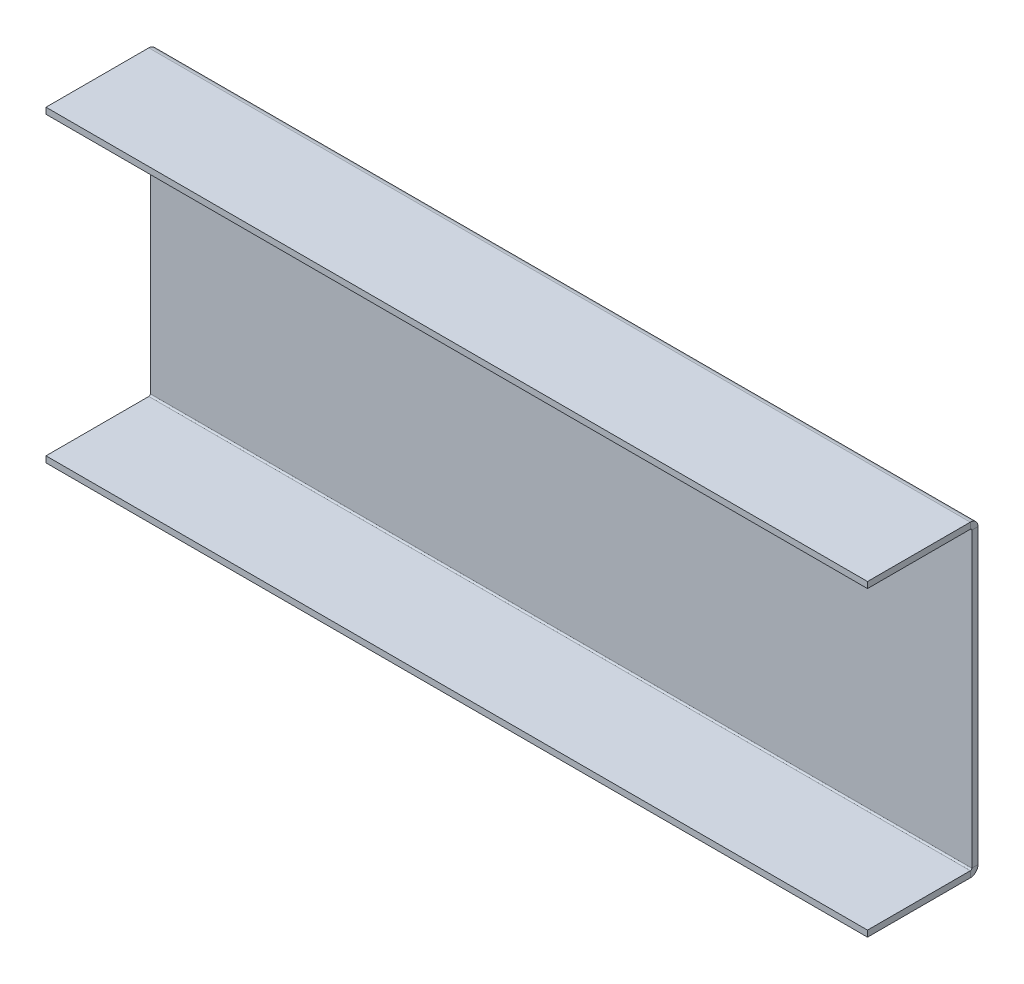
ISO-10303-21;
HEADER;
FILE_DESCRIPTION(('STEP AP214'),'2;1');
FILE_NAME('part.step','',(''),(''),'','','');
FILE_SCHEMA(('AUTOMOTIVE_DESIGN { 1 0 10303 214 1 1 1 1 }'));
ENDSEC;
DATA;
#1=APPLICATION_CONTEXT('core data for automotive mechanical design processes');
#2=APPLICATION_PROTOCOL_DEFINITION('international standard','automotive_design',2000,#1);
#3=PRODUCT_CONTEXT('',#1,'mechanical');
#4=PRODUCT('Part','Part','',(#3));
#5=PRODUCT_RELATED_PRODUCT_CATEGORY('part','',(#4));
#6=PRODUCT_DEFINITION_FORMATION('','',#4);
#7=PRODUCT_DEFINITION_CONTEXT('part definition',#1,'design');
#8=PRODUCT_DEFINITION('design','',#6,#7);
#9=PRODUCT_DEFINITION_SHAPE('','',#8);
#10=(LENGTH_UNIT() NAMED_UNIT(*) SI_UNIT(.MILLI.,.METRE.));
#11=(NAMED_UNIT(*) PLANE_ANGLE_UNIT() SI_UNIT($,.RADIAN.));
#12=(NAMED_UNIT(*) SI_UNIT($,.STERADIAN.) SOLID_ANGLE_UNIT());
#13=UNCERTAINTY_MEASURE_WITH_UNIT(LENGTH_MEASURE(1.E-05),#10,'distance_accuracy_value','');
#14=(GEOMETRIC_REPRESENTATION_CONTEXT(3) GLOBAL_UNCERTAINTY_ASSIGNED_CONTEXT((#13)) GLOBAL_UNIT_ASSIGNED_CONTEXT((#10,
#11,#12)) REPRESENTATION_CONTEXT('',''));
#15=CARTESIAN_POINT('',(0.,0.,0.));
#16=DIRECTION('',(0.,0.,1.));
#17=DIRECTION('',(1.,0.,0.));
#18=AXIS2_PLACEMENT_3D('',#15,#16,#17);
#19=CARTESIAN_POINT('',(0.,0.,-3.));
#20=DIRECTION('',(0.,0.,1.));
#21=DIRECTION('',(1.,0.,0.));
#22=AXIS2_PLACEMENT_3D('',#19,#20,#21);
#23=PLANE('',#22);
#24=DIRECTION('',(-1.,0.,0.));
#25=VECTOR('',#24,1.);
#26=CARTESIAN_POINT('',(-200.,71.2634,-3.00000000000002));
#27=LINE('',#26,#25);
#28=CARTESIAN_POINT('',(-200.,71.2634,-3.00000000000002));
#29=VERTEX_POINT('',#28);
#30=CARTESIAN_POINT('',(200.,71.2634,-3.));
#31=VERTEX_POINT('',#30);
#32=EDGE_CURVE('E209',#29,#31,#27,.F.);
#33=ORIENTED_EDGE('',*,*,#32,.T.);
#34=DIRECTION('',(0.,1.,0.));
#35=VECTOR('',#34,1.);
#36=CARTESIAN_POINT('',(200.,75.,-3.));
#37=LINE('',#36,#35);
#38=CARTESIAN_POINT('',(200.,-71.2634,-2.99999999999998));
#39=VERTEX_POINT('',#38);
#40=EDGE_CURVE('E86',#39,#31,#37,.T.);
#41=ORIENTED_EDGE('',*,*,#40,.F.);
#42=DIRECTION('',(1.,0.,0.));
#43=VECTOR('',#42,1.);
#44=CARTESIAN_POINT('',(200.,-71.2634,-2.99999999999998));
#45=LINE('',#44,#43);
#46=CARTESIAN_POINT('',(-200.,-71.2634,-3.));
#47=VERTEX_POINT('',#46);
#48=EDGE_CURVE('E262',#39,#47,#45,.F.);
#49=ORIENTED_EDGE('',*,*,#48,.T.);
#50=DIRECTION('',(0.,-1.,0.));
#51=VECTOR('',#50,1.);
#52=CARTESIAN_POINT('',(-200.,75.,-3.));
#53=LINE('',#52,#51);
#54=EDGE_CURVE('E13',#29,#47,#53,.T.);
#55=ORIENTED_EDGE('',*,*,#54,.F.);
#56=EDGE_LOOP('',(#33,#41,#49,#55));
#57=FACE_BOUND('',#56,.T.);
#58=ADVANCED_FACE('F77',(#57),#23,.F.);
#59=CARTESIAN_POINT('',(0.,0.,0.));
#60=DIRECTION('',(0.,0.,1.));
#61=DIRECTION('',(1.,0.,0.));
#62=AXIS2_PLACEMENT_3D('',#59,#60,#61);
#63=PLANE('',#62);
#64=DIRECTION('',(0.,1.,0.));
#65=VECTOR('',#64,1.);
#66=CARTESIAN_POINT('',(200.,75.,0.));
#67=LINE('',#66,#65);
#68=CARTESIAN_POINT('',(200.,-71.2634,0.));
#69=VERTEX_POINT('',#68);
#70=CARTESIAN_POINT('',(200.,71.2634,0.));
#71=VERTEX_POINT('',#70);
#72=EDGE_CURVE('E280',#69,#71,#67,.T.);
#73=ORIENTED_EDGE('',*,*,#72,.T.);
#74=DIRECTION('',(-1.,0.,0.));
#75=VECTOR('',#74,1.);
#76=CARTESIAN_POINT('',(-200.,71.2634,0.));
#77=LINE('',#76,#75);
#78=CARTESIAN_POINT('',(-200.,71.2634,0.));
#79=VERTEX_POINT('',#78);
#80=EDGE_CURVE('E221',#79,#71,#77,.F.);
#81=ORIENTED_EDGE('',*,*,#80,.F.);
#82=DIRECTION('',(0.,-1.,0.));
#83=VECTOR('',#82,1.);
#84=CARTESIAN_POINT('',(-200.,75.,0.));
#85=LINE('',#84,#83);
#86=CARTESIAN_POINT('',(-200.,-71.2634,0.));
#87=VERTEX_POINT('',#86);
#88=EDGE_CURVE('E81',#79,#87,#85,.T.);
#89=ORIENTED_EDGE('',*,*,#88,.T.);
#90=DIRECTION('',(1.,0.,0.));
#91=VECTOR('',#90,1.);
#92=CARTESIAN_POINT('',(200.,-71.2634,0.));
#93=LINE('',#92,#91);
#94=EDGE_CURVE('E94',#69,#87,#93,.F.);
#95=ORIENTED_EDGE('',*,*,#94,.F.);
#96=EDGE_LOOP('',(#73,#81,#89,#95));
#97=FACE_BOUND('',#96,.T.);
#98=ADVANCED_FACE('F285',(#97),#63,.T.);
#99=CARTESIAN_POINT('',(-200.,75.,-3.));
#100=DIRECTION('',(-1.,0.,0.));
#101=DIRECTION('',(0.,-1.,0.));
#102=AXIS2_PLACEMENT_3D('',#99,#100,#101);
#103=PLANE('',#102);
#104=ORIENTED_EDGE('',*,*,#88,.F.);
#105=DIRECTION('',(0.,0.,-1.));
#106=VECTOR('',#105,1.);
#107=CARTESIAN_POINT('',(-200.,71.2634,0.));
#108=LINE('',#107,#106);
#109=EDGE_CURVE('E215',#79,#29,#108,.T.);
#110=ORIENTED_EDGE('',*,*,#109,.T.);
#111=ORIENTED_EDGE('',*,*,#54,.T.);
#112=DIRECTION('',(0.,0.,-1.));
#113=VECTOR('',#112,1.);
#114=CARTESIAN_POINT('',(-200.,-71.2634,0.));
#115=LINE('',#114,#113);
#116=EDGE_CURVE('E277',#87,#47,#115,.T.);
#117=ORIENTED_EDGE('',*,*,#116,.F.);
#118=EDGE_LOOP('',(#104,#110,#111,#117));
#119=FACE_BOUND('',#118,.T.);
#120=ADVANCED_FACE('F287',(#119),#103,.T.);
#121=CARTESIAN_POINT('',(200.,75.,-3.));
#122=DIRECTION('',(1.,0.,0.));
#123=DIRECTION('',(0.,1.,0.));
#124=AXIS2_PLACEMENT_3D('',#121,#122,#123);
#125=PLANE('',#124);
#126=DIRECTION('',(0.,0.,-1.));
#127=VECTOR('',#126,1.);
#128=CARTESIAN_POINT('',(200.,71.2634,0.));
#129=LINE('',#128,#127);
#130=EDGE_CURVE('E227',#71,#31,#129,.T.);
#131=ORIENTED_EDGE('',*,*,#130,.F.);
#132=ORIENTED_EDGE('',*,*,#72,.F.);
#133=DIRECTION('',(0.,0.,-1.));
#134=VECTOR('',#133,1.);
#135=CARTESIAN_POINT('',(200.,-71.2634,0.));
#136=LINE('',#135,#134);
#137=EDGE_CURVE('E268',#69,#39,#136,.T.);
#138=ORIENTED_EDGE('',*,*,#137,.T.);
#139=ORIENTED_EDGE('',*,*,#40,.T.);
#140=EDGE_LOOP('',(#131,#132,#138,#139));
#141=FACE_BOUND('',#140,.T.);
#142=ADVANCED_FACE('F79',(#141),#125,.T.);
#143=CARTESIAN_POINT('',(-200.,-71.2634,0.736599999999999));
#144=DIRECTION('',(-1.,0.,0.));
#145=DIRECTION('',(0.,0.,1.));
#146=AXIS2_PLACEMENT_3D('',#143,#144,#145);
#147=PLANE('',#146);
#148=DIRECTION('',(0.,1.,0.));
#149=VECTOR('',#148,1.);
#150=CARTESIAN_POINT('',(-200.,-75.,0.736599999999993));
#151=LINE('',#150,#149);
#152=CARTESIAN_POINT('',(-200.,-72.,0.736599999999996));
#153=VERTEX_POINT('',#152);
#154=CARTESIAN_POINT('',(-200.,-75.,0.736599999999985));
#155=VERTEX_POINT('',#154);
#156=EDGE_CURVE('E230',#153,#155,#151,.F.);
#157=ORIENTED_EDGE('',*,*,#156,.F.);
#158=CARTESIAN_POINT('',(-200.,-71.2634,0.736599999999999));
#159=DIRECTION('',(1.,0.,0.));
#160=DIRECTION('',(0.,0.,-1.));
#161=AXIS2_PLACEMENT_3D('',#158,#159,#160);
#162=CIRCLE('',#161,0.736600000000004);
#163=EDGE_CURVE('E271',#87,#153,#162,.F.);
#164=ORIENTED_EDGE('',*,*,#163,.F.);
#165=ORIENTED_EDGE('',*,*,#116,.T.);
#166=CARTESIAN_POINT('',(-200.,-71.2634,0.736599999999999));
#167=DIRECTION('',(1.,0.,0.));
#168=DIRECTION('',(0.,0.,-1.));
#169=AXIS2_PLACEMENT_3D('',#166,#167,#168);
#170=CIRCLE('',#169,3.7366);
#171=EDGE_CURVE('E264',#47,#155,#170,.F.);
#172=ORIENTED_EDGE('',*,*,#171,.T.);
#173=EDGE_LOOP('',(#157,#164,#165,#172));
#174=FACE_BOUND('',#173,.T.);
#175=ADVANCED_FACE('F295',(#174),#147,.T.);
#176=CARTESIAN_POINT('',(200.,-71.2634,0.736600000000028));
#177=DIRECTION('',(-1.,0.,0.));
#178=DIRECTION('',(0.,0.,1.));
#179=AXIS2_PLACEMENT_3D('',#176,#177,#178);
#180=PLANE('',#179);
#181=CARTESIAN_POINT('',(200.,-71.2634,0.736600000000028));
#182=DIRECTION('',(1.,0.,0.));
#183=DIRECTION('',(0.,0.,-1.));
#184=AXIS2_PLACEMENT_3D('',#181,#182,#183);
#185=CIRCLE('',#184,0.736600000000004);
#186=CARTESIAN_POINT('',(200.,-72.,0.736600000000025));
#187=VERTEX_POINT('',#186);
#188=EDGE_CURVE('E235',#187,#69,#185,.T.);
#189=ORIENTED_EDGE('',*,*,#188,.F.);
#190=DIRECTION('',(0.,1.,0.));
#191=VECTOR('',#190,1.);
#192=CARTESIAN_POINT('',(200.,-72.,0.736600000000018));
#193=LINE('',#192,#191);
#194=CARTESIAN_POINT('',(200.,-75.,0.736600000000007));
#195=VERTEX_POINT('',#194);
#196=EDGE_CURVE('E255',#187,#195,#193,.F.);
#197=ORIENTED_EDGE('',*,*,#196,.T.);
#198=CARTESIAN_POINT('',(200.,-71.2634,0.736600000000028));
#199=DIRECTION('',(1.,0.,0.));
#200=DIRECTION('',(0.,0.,-1.));
#201=AXIS2_PLACEMENT_3D('',#198,#199,#200);
#202=CIRCLE('',#201,3.7366);
#203=EDGE_CURVE('E265',#195,#39,#202,.T.);
#204=ORIENTED_EDGE('',*,*,#203,.T.);
#205=ORIENTED_EDGE('',*,*,#137,.F.);
#206=EDGE_LOOP('',(#189,#197,#204,#205));
#207=FACE_BOUND('',#206,.T.);
#208=ADVANCED_FACE('F316',(#207),#180,.F.);
#209=CARTESIAN_POINT('',(200.,-71.2634,0.736600000000028));
#210=DIRECTION('',(1.,0.,0.));
#211=DIRECTION('',(0.,-1.,0.));
#212=AXIS2_PLACEMENT_3D('',#209,#210,#211);
#213=CYLINDRICAL_SURFACE('',#212,3.7366);
#214=ORIENTED_EDGE('',*,*,#48,.F.);
#215=ORIENTED_EDGE('',*,*,#203,.F.);
#216=DIRECTION('',(1.,0.,0.));
#217=VECTOR('',#216,1.);
#218=CARTESIAN_POINT('',(-200.,-75.,0.736599999999993));
#219=LINE('',#218,#217);
#220=EDGE_CURVE('E253',#195,#155,#219,.F.);
#221=ORIENTED_EDGE('',*,*,#220,.T.);
#222=ORIENTED_EDGE('',*,*,#171,.F.);
#223=EDGE_LOOP('',(#214,#215,#221,#222));
#224=FACE_BOUND('',#223,.T.);
#225=ADVANCED_FACE('F326',(#224),#213,.T.);
#226=CARTESIAN_POINT('',(200.,-71.2634,0.736600000000028));
#227=DIRECTION('',(1.,0.,0.));
#228=DIRECTION('',(0.,-1.,0.));
#229=AXIS2_PLACEMENT_3D('',#226,#227,#228);
#230=CYLINDRICAL_SURFACE('',#229,0.736600000000004);
#231=ORIENTED_EDGE('',*,*,#94,.T.);
#232=ORIENTED_EDGE('',*,*,#163,.T.);
#233=DIRECTION('',(1.,0.,0.));
#234=VECTOR('',#233,1.);
#235=CARTESIAN_POINT('',(-200.,-72.,0.736600000000004));
#236=LINE('',#235,#234);
#237=EDGE_CURVE('E258',#153,#187,#236,.T.);
#238=ORIENTED_EDGE('',*,*,#237,.T.);
#239=ORIENTED_EDGE('',*,*,#188,.T.);
#240=EDGE_LOOP('',(#231,#232,#238,#239));
#241=FACE_BOUND('',#240,.T.);
#242=ADVANCED_FACE('F292',(#241),#230,.F.);
#243=CARTESIAN_POINT('',(200.,-75.0000000000002,50.8));
#244=DIRECTION('',(-1.,0.,0.));
#245=DIRECTION('',(0.,0.,1.));
#246=AXIS2_PLACEMENT_3D('',#243,#244,#245);
#247=PLANE('',#246);
#248=ORIENTED_EDGE('',*,*,#196,.F.);
#249=DIRECTION('',(0.,0.,-1.));
#250=VECTOR('',#249,1.);
#251=CARTESIAN_POINT('',(200.,-72.0000000000002,50.8));
#252=LINE('',#251,#250);
#253=CARTESIAN_POINT('',(200.,-72.0000000000002,50.8));
#254=VERTEX_POINT('',#253);
#255=EDGE_CURVE('E251',#187,#254,#252,.F.);
#256=ORIENTED_EDGE('',*,*,#255,.T.);
#257=DIRECTION('',(0.,1.,0.));
#258=VECTOR('',#257,1.);
#259=CARTESIAN_POINT('',(200.,-75.0000000000002,50.8));
#260=LINE('',#259,#258);
#261=CARTESIAN_POINT('',(200.,-75.0000000000002,50.8));
#262=VERTEX_POINT('',#261);
#263=EDGE_CURVE('E232',#262,#254,#260,.T.);
#264=ORIENTED_EDGE('',*,*,#263,.F.);
#265=DIRECTION('',(0.,0.,1.));
#266=VECTOR('',#265,1.);
#267=CARTESIAN_POINT('',(200.,-75.,-2.76829623398795E-13));
#268=LINE('',#267,#266);
#269=EDGE_CURVE('E244',#195,#262,#268,.T.);
#270=ORIENTED_EDGE('',*,*,#269,.F.);
#271=EDGE_LOOP('',(#248,#256,#264,#270));
#272=FACE_BOUND('',#271,.T.);
#273=ADVANCED_FACE('F318',(#272),#247,.F.);
#274=CARTESIAN_POINT('',(-200.,-75.,0.));
#275=DIRECTION('',(1.,0.,0.));
#276=DIRECTION('',(0.,0.,-1.));
#277=AXIS2_PLACEMENT_3D('',#274,#275,#276);
#278=PLANE('',#277);
#279=ORIENTED_EDGE('',*,*,#156,.T.);
#280=DIRECTION('',(0.,0.,-1.));
#281=VECTOR('',#280,1.);
#282=CARTESIAN_POINT('',(-200.,-75.,-2.76829623398795E-13));
#283=LINE('',#282,#281);
#284=CARTESIAN_POINT('',(-200.,-75.0000000000002,50.8));
#285=VERTEX_POINT('',#284);
#286=EDGE_CURVE('E239',#285,#155,#283,.T.);
#287=ORIENTED_EDGE('',*,*,#286,.F.);
#288=DIRECTION('',(0.,1.,0.));
#289=VECTOR('',#288,1.);
#290=CARTESIAN_POINT('',(-200.,-75.0000000000002,50.8));
#291=LINE('',#290,#289);
#292=CARTESIAN_POINT('',(-200.,-72.0000000000002,50.8));
#293=VERTEX_POINT('',#292);
#294=EDGE_CURVE('E236',#285,#293,#291,.T.);
#295=ORIENTED_EDGE('',*,*,#294,.T.);
#296=DIRECTION('',(0.,0.,1.));
#297=VECTOR('',#296,1.);
#298=CARTESIAN_POINT('',(-200.,-72.,0.));
#299=LINE('',#298,#297);
#300=EDGE_CURVE('E246',#293,#153,#299,.F.);
#301=ORIENTED_EDGE('',*,*,#300,.T.);
#302=EDGE_LOOP('',(#279,#287,#295,#301));
#303=FACE_BOUND('',#302,.T.);
#304=ADVANCED_FACE('F298',(#303),#278,.F.);
#305=CARTESIAN_POINT('',(0.,-75.,-2.76829623398795E-13));
#306=DIRECTION('',(0.,1.,0.));
#307=DIRECTION('',(0.,0.,1.));
#308=AXIS2_PLACEMENT_3D('',#305,#306,#307);
#309=PLANE('',#308);
#310=ORIENTED_EDGE('',*,*,#220,.F.);
#311=ORIENTED_EDGE('',*,*,#269,.T.);
#312=DIRECTION('',(-1.,0.,0.));
#313=VECTOR('',#312,1.);
#314=CARTESIAN_POINT('',(0.,-75.0000000000002,50.8));
#315=LINE('',#314,#313);
#316=EDGE_CURVE('E242',#262,#285,#315,.T.);
#317=ORIENTED_EDGE('',*,*,#316,.T.);
#318=ORIENTED_EDGE('',*,*,#286,.T.);
#319=EDGE_LOOP('',(#310,#311,#317,#318));
#320=FACE_BOUND('',#319,.T.);
#321=ADVANCED_FACE('F302',(#320),#309,.F.);
#322=CARTESIAN_POINT('',(0.,-72.,-2.66355179382266E-13));
#323=DIRECTION('',(0.,1.,0.));
#324=DIRECTION('',(0.,0.,1.));
#325=AXIS2_PLACEMENT_3D('',#322,#323,#324);
#326=PLANE('',#325);
#327=ORIENTED_EDGE('',*,*,#255,.F.);
#328=ORIENTED_EDGE('',*,*,#237,.F.);
#329=ORIENTED_EDGE('',*,*,#300,.F.);
#330=DIRECTION('',(1.,0.,0.));
#331=VECTOR('',#330,1.);
#332=CARTESIAN_POINT('',(-200.,-72.0000000000002,50.8));
#333=LINE('',#332,#331);
#334=EDGE_CURVE('E249',#254,#293,#333,.F.);
#335=ORIENTED_EDGE('',*,*,#334,.F.);
#336=EDGE_LOOP('',(#327,#328,#329,#335));
#337=FACE_BOUND('',#336,.T.);
#338=ADVANCED_FACE('F312',(#337),#326,.T.);
#339=CARTESIAN_POINT('',(-200.,-75.0000000000002,50.8));
#340=DIRECTION('',(0.,0.,-1.));
#341=DIRECTION('',(0.,1.,0.));
#342=AXIS2_PLACEMENT_3D('',#339,#340,#341);
#343=PLANE('',#342);
#344=ORIENTED_EDGE('',*,*,#334,.T.);
#345=ORIENTED_EDGE('',*,*,#294,.F.);
#346=ORIENTED_EDGE('',*,*,#316,.F.);
#347=ORIENTED_EDGE('',*,*,#263,.T.);
#348=EDGE_LOOP('',(#344,#345,#346,#347));
#349=FACE_BOUND('',#348,.T.);
#350=ADVANCED_FACE('F308',(#349),#343,.F.);
#351=CARTESIAN_POINT('',(200.,71.2634,0.736600000000014));
#352=DIRECTION('',(1.,0.,0.));
#353=DIRECTION('',(0.,0.,-1.));
#354=AXIS2_PLACEMENT_3D('',#351,#352,#353);
#355=PLANE('',#354);
#356=DIRECTION('',(0.,-1.,0.));
#357=VECTOR('',#356,1.);
#358=CARTESIAN_POINT('',(200.,75.,0.736599999999993));
#359=LINE('',#358,#357);
#360=CARTESIAN_POINT('',(200.,72.,0.736600000000012));
#361=VERTEX_POINT('',#360);
#362=CARTESIAN_POINT('',(200.,75.,0.736600000000001));
#363=VERTEX_POINT('',#362);
#364=EDGE_CURVE('E192',#361,#363,#359,.F.);
#365=ORIENTED_EDGE('',*,*,#364,.F.);
#366=CARTESIAN_POINT('',(200.,71.2634,0.736600000000014));
#367=DIRECTION('',(-1.,0.,0.));
#368=DIRECTION('',(0.,0.,1.));
#369=AXIS2_PLACEMENT_3D('',#366,#367,#368);
#370=CIRCLE('',#369,0.736600000000004);
#371=EDGE_CURVE('E218',#71,#361,#370,.F.);
#372=ORIENTED_EDGE('',*,*,#371,.F.);
#373=ORIENTED_EDGE('',*,*,#130,.T.);
#374=CARTESIAN_POINT('',(200.,71.2634,0.736600000000014));
#375=DIRECTION('',(-1.,0.,0.));
#376=DIRECTION('',(0.,0.,1.));
#377=AXIS2_PLACEMENT_3D('',#374,#375,#376);
#378=CIRCLE('',#377,3.7366);
#379=EDGE_CURVE('E211',#31,#363,#378,.F.);
#380=ORIENTED_EDGE('',*,*,#379,.T.);
#381=EDGE_LOOP('',(#365,#372,#373,#380));
#382=FACE_BOUND('',#381,.T.);
#383=ADVANCED_FACE('F350',(#382),#355,.T.);
#384=CARTESIAN_POINT('',(-200.,71.2634,0.736599999999985));
#385=DIRECTION('',(1.,0.,0.));
#386=DIRECTION('',(0.,0.,-1.));
#387=AXIS2_PLACEMENT_3D('',#384,#385,#386);
#388=PLANE('',#387);
#389=CARTESIAN_POINT('',(-200.,71.2634,0.736599999999985));
#390=DIRECTION('',(-1.,0.,0.));
#391=DIRECTION('',(0.,0.,1.));
#392=AXIS2_PLACEMENT_3D('',#389,#390,#391);
#393=CIRCLE('',#392,0.736600000000004);
#394=CARTESIAN_POINT('',(-200.,72.,0.736599999999982));
#395=VERTEX_POINT('',#394);
#396=EDGE_CURVE('E224',#395,#79,#393,.T.);
#397=ORIENTED_EDGE('',*,*,#396,.F.);
#398=DIRECTION('',(0.,-1.,0.));
#399=VECTOR('',#398,1.);
#400=CARTESIAN_POINT('',(-200.,72.,0.73659999999999));
#401=LINE('',#400,#399);
#402=CARTESIAN_POINT('',(-200.,75.,0.736599999999979));
#403=VERTEX_POINT('',#402);
#404=EDGE_CURVE('E203',#395,#403,#401,.F.);
#405=ORIENTED_EDGE('',*,*,#404,.T.);
#406=CARTESIAN_POINT('',(-200.,71.2634,0.736599999999985));
#407=DIRECTION('',(-1.,0.,0.));
#408=DIRECTION('',(0.,0.,1.));
#409=AXIS2_PLACEMENT_3D('',#406,#407,#408);
#410=CIRCLE('',#409,3.7366);
#411=EDGE_CURVE('E212',#403,#29,#410,.T.);
#412=ORIENTED_EDGE('',*,*,#411,.T.);
#413=ORIENTED_EDGE('',*,*,#109,.F.);
#414=EDGE_LOOP('',(#397,#405,#412,#413));
#415=FACE_BOUND('',#414,.T.);
#416=ADVANCED_FACE('F366',(#415),#388,.F.);
#417=CARTESIAN_POINT('',(-200.,71.2634,0.736599999999985));
#418=DIRECTION('',(-1.,0.,0.));
#419=DIRECTION('',(0.,1.,0.));
#420=AXIS2_PLACEMENT_3D('',#417,#418,#419);
#421=CYLINDRICAL_SURFACE('',#420,3.7366);
#422=ORIENTED_EDGE('',*,*,#32,.F.);
#423=ORIENTED_EDGE('',*,*,#411,.F.);
#424=DIRECTION('',(-1.,0.,0.));
#425=VECTOR('',#424,1.);
#426=CARTESIAN_POINT('',(200.,75.,0.736599999999993));
#427=LINE('',#426,#425);
#428=EDGE_CURVE('E201',#403,#363,#427,.F.);
#429=ORIENTED_EDGE('',*,*,#428,.T.);
#430=ORIENTED_EDGE('',*,*,#379,.F.);
#431=EDGE_LOOP('',(#422,#423,#429,#430));
#432=FACE_BOUND('',#431,.T.);
#433=ADVANCED_FACE('F353',(#432),#421,.T.);
#434=CARTESIAN_POINT('',(-200.,71.2634,0.736599999999985));
#435=DIRECTION('',(-1.,0.,0.));
#436=DIRECTION('',(0.,1.,0.));
#437=AXIS2_PLACEMENT_3D('',#434,#435,#436);
#438=CYLINDRICAL_SURFACE('',#437,0.736600000000004);
#439=ORIENTED_EDGE('',*,*,#80,.T.);
#440=ORIENTED_EDGE('',*,*,#371,.T.);
#441=DIRECTION('',(-1.,0.,0.));
#442=VECTOR('',#441,1.);
#443=CARTESIAN_POINT('',(200.,72.,0.736600000000004));
#444=LINE('',#443,#442);
#445=EDGE_CURVE('E206',#361,#395,#444,.T.);
#446=ORIENTED_EDGE('',*,*,#445,.T.);
#447=ORIENTED_EDGE('',*,*,#396,.T.);
#448=EDGE_LOOP('',(#439,#440,#446,#447));
#449=FACE_BOUND('',#448,.T.);
#450=ADVANCED_FACE('F364',(#449),#438,.F.);
#451=CARTESIAN_POINT('',(200.,75.,0.));
#452=DIRECTION('',(-1.,0.,0.));
#453=DIRECTION('',(0.,0.,1.));
#454=AXIS2_PLACEMENT_3D('',#451,#452,#453);
#455=PLANE('',#454);
#456=ORIENTED_EDGE('',*,*,#364,.T.);
#457=DIRECTION('',(0.,0.,-1.));
#458=VECTOR('',#457,1.);
#459=CARTESIAN_POINT('',(200.,75.,-2.76829623398795E-13));
#460=LINE('',#459,#458);
#461=CARTESIAN_POINT('',(200.,75.0000000000002,50.8));
#462=VERTEX_POINT('',#461);
#463=EDGE_CURVE('E173',#462,#363,#460,.T.);
#464=ORIENTED_EDGE('',*,*,#463,.F.);
#465=DIRECTION('',(0.,-1.,0.));
#466=VECTOR('',#465,1.);
#467=CARTESIAN_POINT('',(200.,75.0000000000002,50.8));
#468=LINE('',#467,#466);
#469=CARTESIAN_POINT('',(200.,72.0000000000002,50.8));
#470=VERTEX_POINT('',#469);
#471=EDGE_CURVE('E179',#462,#470,#468,.T.);
#472=ORIENTED_EDGE('',*,*,#471,.T.);
#473=DIRECTION('',(0.,0.,1.));
#474=VECTOR('',#473,1.);
#475=CARTESIAN_POINT('',(200.,72.,0.));
#476=LINE('',#475,#474);
#477=EDGE_CURVE('E199',#470,#361,#476,.F.);
#478=ORIENTED_EDGE('',*,*,#477,.T.);
#479=EDGE_LOOP('',(#456,#464,#472,#478));
#480=FACE_BOUND('',#479,.T.);
#481=ADVANCED_FACE('F191',(#480),#455,.F.);
#482=CARTESIAN_POINT('',(-200.,75.0000000000002,50.8));
#483=DIRECTION('',(1.,0.,0.));
#484=DIRECTION('',(0.,0.,-1.));
#485=AXIS2_PLACEMENT_3D('',#482,#483,#484);
#486=PLANE('',#485);
#487=ORIENTED_EDGE('',*,*,#404,.F.);
#488=DIRECTION('',(0.,0.,-1.));
#489=VECTOR('',#488,1.);
#490=CARTESIAN_POINT('',(-200.,72.0000000000002,50.8));
#491=LINE('',#490,#489);
#492=CARTESIAN_POINT('',(-200.,72.0000000000002,50.8));
#493=VERTEX_POINT('',#492);
#494=EDGE_CURVE('E195',#395,#493,#491,.F.);
#495=ORIENTED_EDGE('',*,*,#494,.T.);
#496=DIRECTION('',(0.,-1.,0.));
#497=VECTOR('',#496,1.);
#498=CARTESIAN_POINT('',(-200.,75.0000000000002,50.8));
#499=LINE('',#498,#497);
#500=CARTESIAN_POINT('',(-200.,75.0000000000002,50.8));
#501=VERTEX_POINT('',#500);
#502=EDGE_CURVE('E188',#501,#493,#499,.T.);
#503=ORIENTED_EDGE('',*,*,#502,.F.);
#504=DIRECTION('',(0.,0.,1.));
#505=VECTOR('',#504,1.);
#506=CARTESIAN_POINT('',(-200.,75.,-2.76829623398795E-13));
#507=LINE('',#506,#505);
#508=EDGE_CURVE('E175',#403,#501,#507,.T.);
#509=ORIENTED_EDGE('',*,*,#508,.F.);
#510=EDGE_LOOP('',(#487,#495,#503,#509));
#511=FACE_BOUND('',#510,.T.);
#512=ADVANCED_FACE('F356',(#511),#486,.F.);
#513=CARTESIAN_POINT('',(0.,75.,-2.76829623398795E-13));
#514=DIRECTION('',(0.,-1.,0.));
#515=DIRECTION('',(0.,0.,-1.));
#516=AXIS2_PLACEMENT_3D('',#513,#514,#515);
#517=PLANE('',#516);
#518=ORIENTED_EDGE('',*,*,#428,.F.);
#519=ORIENTED_EDGE('',*,*,#508,.T.);
#520=DIRECTION('',(1.,0.,0.));
#521=VECTOR('',#520,1.);
#522=CARTESIAN_POINT('',(0.,75.0000000000002,50.8));
#523=LINE('',#522,#521);
#524=EDGE_CURVE('E168',#501,#462,#523,.T.);
#525=ORIENTED_EDGE('',*,*,#524,.T.);
#526=ORIENTED_EDGE('',*,*,#463,.T.);
#527=EDGE_LOOP('',(#518,#519,#525,#526));
#528=FACE_BOUND('',#527,.T.);
#529=ADVANCED_FACE('F171',(#528),#517,.F.);
#530=CARTESIAN_POINT('',(0.,72.,-2.66355179382266E-13));
#531=DIRECTION('',(0.,-1.,0.));
#532=DIRECTION('',(0.,0.,-1.));
#533=AXIS2_PLACEMENT_3D('',#530,#531,#532);
#534=PLANE('',#533);
#535=ORIENTED_EDGE('',*,*,#494,.F.);
#536=ORIENTED_EDGE('',*,*,#445,.F.);
#537=ORIENTED_EDGE('',*,*,#477,.F.);
#538=DIRECTION('',(-1.,0.,0.));
#539=VECTOR('',#538,1.);
#540=CARTESIAN_POINT('',(200.,72.0000000000002,50.8));
#541=LINE('',#540,#539);
#542=EDGE_CURVE('E184',#493,#470,#541,.F.);
#543=ORIENTED_EDGE('',*,*,#542,.F.);
#544=EDGE_LOOP('',(#535,#536,#537,#543));
#545=FACE_BOUND('',#544,.T.);
#546=ADVANCED_FACE('F360',(#545),#534,.T.);
#547=CARTESIAN_POINT('',(200.,75.0000000000002,50.8));
#548=DIRECTION('',(0.,0.,-1.));
#549=DIRECTION('',(0.,1.,0.));
#550=AXIS2_PLACEMENT_3D('',#547,#548,#549);
#551=PLANE('',#550);
#552=ORIENTED_EDGE('',*,*,#542,.T.);
#553=ORIENTED_EDGE('',*,*,#471,.F.);
#554=ORIENTED_EDGE('',*,*,#524,.F.);
#555=ORIENTED_EDGE('',*,*,#502,.T.);
#556=EDGE_LOOP('',(#552,#553,#554,#555));
#557=FACE_BOUND('',#556,.T.);
#558=ADVANCED_FACE('F182',(#557),#551,.F.);
#559=CLOSED_SHELL('',(#58,#98,#120,#142,#175,#208,#225,#242,#273,#304,#321,#338,#350,#383,#416,
#433,#450,#481,#512,#529,#546,#558));
#560=MANIFOLD_SOLID_BREP('B2',#559);
#561=ADVANCED_BREP_SHAPE_REPRESENTATION('',(#18,#560),#14);
#562=SHAPE_DEFINITION_REPRESENTATION(#9,#561);
ENDSEC;
END-ISO-10303-21;
